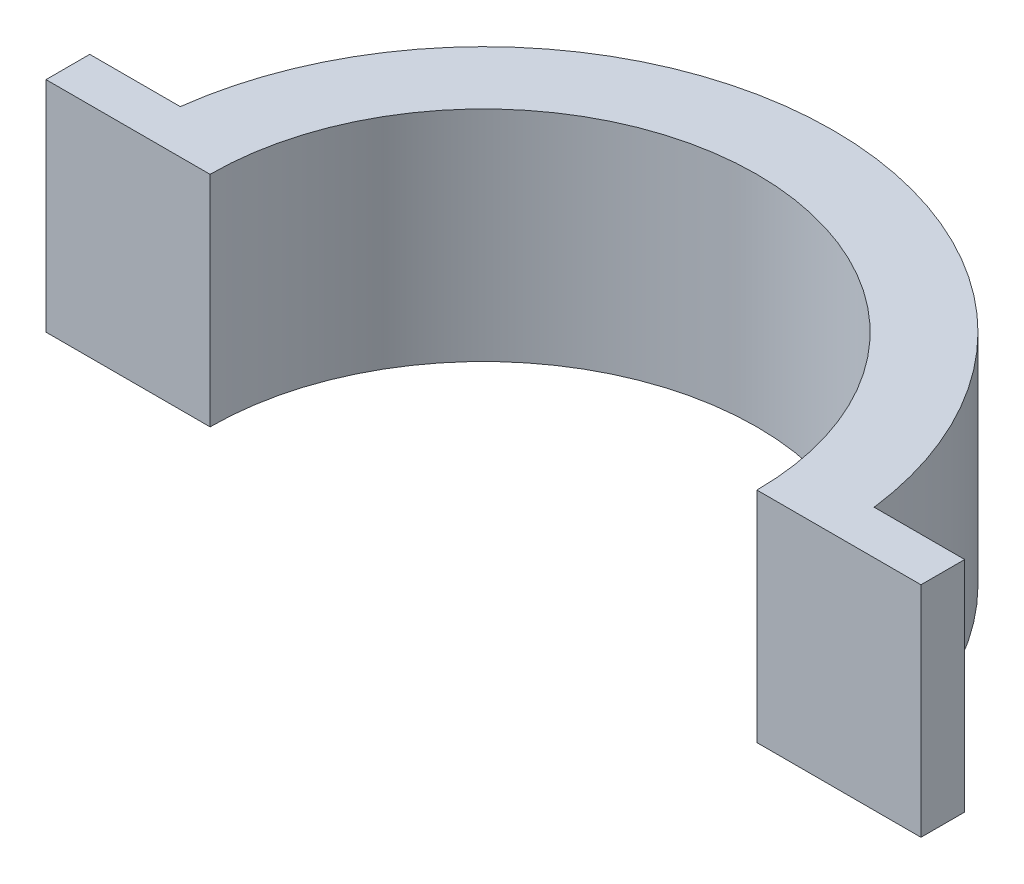
ISO-10303-21;
HEADER;
FILE_DESCRIPTION(('STEP AP214'),'2;1');
FILE_NAME('part.step','',(''),(''),'','','');
FILE_SCHEMA(('AUTOMOTIVE_DESIGN { 1 0 10303 214 1 1 1 1 }'));
ENDSEC;
DATA;
#1=APPLICATION_CONTEXT('core data for automotive mechanical design processes');
#2=APPLICATION_PROTOCOL_DEFINITION('international standard','automotive_design',2000,#1);
#3=PRODUCT_CONTEXT('',#1,'mechanical');
#4=PRODUCT('Part','Part','',(#3));
#5=PRODUCT_RELATED_PRODUCT_CATEGORY('part','',(#4));
#6=PRODUCT_DEFINITION_FORMATION('','',#4);
#7=PRODUCT_DEFINITION_CONTEXT('part definition',#1,'design');
#8=PRODUCT_DEFINITION('design','',#6,#7);
#9=PRODUCT_DEFINITION_SHAPE('','',#8);
#10=(LENGTH_UNIT() NAMED_UNIT(*) SI_UNIT(.MILLI.,.METRE.));
#11=(NAMED_UNIT(*) PLANE_ANGLE_UNIT() SI_UNIT($,.RADIAN.));
#12=(NAMED_UNIT(*) SI_UNIT($,.STERADIAN.) SOLID_ANGLE_UNIT());
#13=UNCERTAINTY_MEASURE_WITH_UNIT(LENGTH_MEASURE(1.E-05),#10,'distance_accuracy_value','');
#14=(GEOMETRIC_REPRESENTATION_CONTEXT(3) GLOBAL_UNCERTAINTY_ASSIGNED_CONTEXT((#13)) GLOBAL_UNIT_ASSIGNED_CONTEXT((#10,
#11,#12)) REPRESENTATION_CONTEXT('',''));
#15=CARTESIAN_POINT('',(0.,0.,0.));
#16=DIRECTION('',(0.,0.,1.));
#17=DIRECTION('',(1.,0.,0.));
#18=AXIS2_PLACEMENT_3D('',#15,#16,#17);
#19=CARTESIAN_POINT('',(0.,10.,0.));
#20=DIRECTION('',(0.,0.,1.));
#21=DIRECTION('',(1.,0.,0.));
#22=AXIS2_PLACEMENT_3D('',#19,#20,#21);
#23=PLANE('',#22);
#24=DIRECTION('',(-1.,0.,0.));
#25=VECTOR('',#24,1.);
#26=CARTESIAN_POINT('',(0.,0.,0.));
#27=LINE('',#26,#25);
#28=CARTESIAN_POINT('',(-12.5,0.,0.));
#29=VERTEX_POINT('',#28);
#30=CARTESIAN_POINT('',(-20.,0.,0.));
#31=VERTEX_POINT('',#30);
#32=EDGE_CURVE('E131',#29,#31,#27,.T.);
#33=ORIENTED_EDGE('',*,*,#32,.F.);
#34=DIRECTION('',(0.,-1.,0.));
#35=VECTOR('',#34,1.);
#36=CARTESIAN_POINT('',(-12.5,10.,0.));
#37=LINE('',#36,#35);
#38=CARTESIAN_POINT('',(-12.5,10.,0.));
#39=VERTEX_POINT('',#38);
#40=EDGE_CURVE('E11',#39,#29,#37,.T.);
#41=ORIENTED_EDGE('',*,*,#40,.F.);
#42=DIRECTION('',(-1.,0.,0.));
#43=VECTOR('',#42,1.);
#44=CARTESIAN_POINT('',(0.,10.,0.));
#45=LINE('',#44,#43);
#46=CARTESIAN_POINT('',(-20.,10.,0.));
#47=VERTEX_POINT('',#46);
#48=EDGE_CURVE('E148',#39,#47,#45,.T.);
#49=ORIENTED_EDGE('',*,*,#48,.T.);
#50=DIRECTION('',(0.,-1.,0.));
#51=VECTOR('',#50,1.);
#52=CARTESIAN_POINT('',(-20.,10.,0.));
#53=LINE('',#52,#51);
#54=EDGE_CURVE('E54',#47,#31,#53,.T.);
#55=ORIENTED_EDGE('',*,*,#54,.T.);
#56=EDGE_LOOP('',(#33,#41,#49,#55));
#57=FACE_BOUND('',#56,.T.);
#58=ADVANCED_FACE('F38',(#57),#23,.T.);
#59=CARTESIAN_POINT('',(0.,10.,0.));
#60=DIRECTION('',(0.,-1.,0.));
#61=DIRECTION('',(0.,0.,-1.));
#62=AXIS2_PLACEMENT_3D('',#59,#60,#61);
#63=CYLINDRICAL_SURFACE('',#62,12.5);
#64=CARTESIAN_POINT('',(0.,0.,0.));
#65=DIRECTION('',(0.,1.,0.));
#66=DIRECTION('',(0.,0.,1.));
#67=AXIS2_PLACEMENT_3D('',#64,#65,#66);
#68=CIRCLE('',#67,12.5);
#69=CARTESIAN_POINT('',(12.5,0.,0.));
#70=VERTEX_POINT('',#69);
#71=EDGE_CURVE('E133',#70,#29,#68,.T.);
#72=ORIENTED_EDGE('',*,*,#71,.F.);
#73=DIRECTION('',(0.,-1.,0.));
#74=VECTOR('',#73,1.);
#75=CARTESIAN_POINT('',(12.5,10.,0.));
#76=LINE('',#75,#74);
#77=CARTESIAN_POINT('',(12.5,10.,0.));
#78=VERTEX_POINT('',#77);
#79=EDGE_CURVE('E46',#78,#70,#76,.T.);
#80=ORIENTED_EDGE('',*,*,#79,.F.);
#81=CARTESIAN_POINT('',(0.,10.,0.));
#82=DIRECTION('',(0.,1.,0.));
#83=DIRECTION('',(0.,0.,1.));
#84=AXIS2_PLACEMENT_3D('',#81,#82,#83);
#85=CIRCLE('',#84,12.5);
#86=EDGE_CURVE('E172',#78,#39,#85,.T.);
#87=ORIENTED_EDGE('',*,*,#86,.T.);
#88=ORIENTED_EDGE('',*,*,#40,.T.);
#89=EDGE_LOOP('',(#72,#80,#87,#88));
#90=FACE_BOUND('',#89,.T.);
#91=ADVANCED_FACE('F171',(#90),#63,.F.);
#92=CARTESIAN_POINT('',(0.,10.,0.));
#93=DIRECTION('',(0.,0.,-1.));
#94=DIRECTION('',(-1.,0.,0.));
#95=AXIS2_PLACEMENT_3D('',#92,#93,#94);
#96=PLANE('',#95);
#97=DIRECTION('',(1.,0.,0.));
#98=VECTOR('',#97,1.);
#99=CARTESIAN_POINT('',(0.,0.,0.));
#100=LINE('',#99,#98);
#101=CARTESIAN_POINT('',(20.,0.,0.));
#102=VERTEX_POINT('',#101);
#103=EDGE_CURVE('E136',#70,#102,#100,.T.);
#104=ORIENTED_EDGE('',*,*,#103,.T.);
#105=DIRECTION('',(0.,-1.,0.));
#106=VECTOR('',#105,1.);
#107=CARTESIAN_POINT('',(20.,10.,0.));
#108=LINE('',#107,#106);
#109=CARTESIAN_POINT('',(20.,10.,0.));
#110=VERTEX_POINT('',#109);
#111=EDGE_CURVE('E155',#110,#102,#108,.T.);
#112=ORIENTED_EDGE('',*,*,#111,.F.);
#113=DIRECTION('',(1.,0.,0.));
#114=VECTOR('',#113,1.);
#115=CARTESIAN_POINT('',(0.,10.,0.));
#116=LINE('',#115,#114);
#117=EDGE_CURVE('E162',#78,#110,#116,.T.);
#118=ORIENTED_EDGE('',*,*,#117,.F.);
#119=ORIENTED_EDGE('',*,*,#79,.T.);
#120=EDGE_LOOP('',(#104,#112,#118,#119));
#121=FACE_BOUND('',#120,.T.);
#122=ADVANCED_FACE('F160',(#121),#96,.F.);
#123=CARTESIAN_POINT('',(20.,10.,0.));
#124=DIRECTION('',(-1.,0.,0.));
#125=DIRECTION('',(0.,0.,1.));
#126=AXIS2_PLACEMENT_3D('',#123,#124,#125);
#127=PLANE('',#126);
#128=DIRECTION('',(0.,0.,-1.));
#129=VECTOR('',#128,1.);
#130=CARTESIAN_POINT('',(20.,0.,0.));
#131=LINE('',#130,#129);
#132=CARTESIAN_POINT('',(20.,0.,-2.));
#133=VERTEX_POINT('',#132);
#134=EDGE_CURVE('E138',#102,#133,#131,.T.);
#135=ORIENTED_EDGE('',*,*,#134,.T.);
#136=DIRECTION('',(0.,-1.,0.));
#137=VECTOR('',#136,1.);
#138=CARTESIAN_POINT('',(20.,10.,-2.));
#139=LINE('',#138,#137);
#140=CARTESIAN_POINT('',(20.,10.,-2.));
#141=VERTEX_POINT('',#140);
#142=EDGE_CURVE('E152',#141,#133,#139,.T.);
#143=ORIENTED_EDGE('',*,*,#142,.F.);
#144=DIRECTION('',(0.,0.,-1.));
#145=VECTOR('',#144,1.);
#146=CARTESIAN_POINT('',(20.,10.,0.));
#147=LINE('',#146,#145);
#148=EDGE_CURVE('E276',#110,#141,#147,.T.);
#149=ORIENTED_EDGE('',*,*,#148,.F.);
#150=ORIENTED_EDGE('',*,*,#111,.T.);
#151=EDGE_LOOP('',(#135,#143,#149,#150));
#152=FACE_BOUND('',#151,.T.);
#153=ADVANCED_FACE('F190',(#152),#127,.F.);
#154=CARTESIAN_POINT('',(0.,10.,-2.));
#155=DIRECTION('',(0.,0.,1.));
#156=DIRECTION('',(1.,0.,0.));
#157=AXIS2_PLACEMENT_3D('',#154,#155,#156);
#158=PLANE('',#157);
#159=DIRECTION('',(-1.,0.,0.));
#160=VECTOR('',#159,1.);
#161=CARTESIAN_POINT('',(0.,0.,-2.));
#162=LINE('',#161,#160);
#163=CARTESIAN_POINT('',(15.8603248711256,0.,-2.));
#164=VERTEX_POINT('',#163);
#165=EDGE_CURVE('E140',#133,#164,#162,.T.);
#166=ORIENTED_EDGE('',*,*,#165,.T.);
#167=DIRECTION('',(0.,-1.,0.));
#168=VECTOR('',#167,1.);
#169=CARTESIAN_POINT('',(15.8603248711256,10.,-2.));
#170=LINE('',#169,#168);
#171=CARTESIAN_POINT('',(15.8603248711256,10.,-2.));
#172=VERTEX_POINT('',#171);
#173=EDGE_CURVE('E123',#172,#164,#170,.T.);
#174=ORIENTED_EDGE('',*,*,#173,.F.);
#175=DIRECTION('',(-1.,0.,0.));
#176=VECTOR('',#175,1.);
#177=CARTESIAN_POINT('',(0.,10.,-2.));
#178=LINE('',#177,#176);
#179=EDGE_CURVE('E111',#141,#172,#178,.T.);
#180=ORIENTED_EDGE('',*,*,#179,.F.);
#181=ORIENTED_EDGE('',*,*,#142,.T.);
#182=EDGE_LOOP('',(#166,#174,#180,#181));
#183=FACE_BOUND('',#182,.T.);
#184=ADVANCED_FACE('F195',(#183),#158,.F.);
#185=CARTESIAN_POINT('',(0.,10.,0.));
#186=DIRECTION('',(0.,-1.,0.));
#187=DIRECTION('',(0.,0.,-1.));
#188=AXIS2_PLACEMENT_3D('',#185,#186,#187);
#189=CYLINDRICAL_SURFACE('',#188,15.9859283439419);
#190=CARTESIAN_POINT('',(0.,0.,0.));
#191=DIRECTION('',(0.,1.,0.));
#192=DIRECTION('',(0.,0.,1.));
#193=AXIS2_PLACEMENT_3D('',#190,#191,#192);
#194=CIRCLE('',#193,15.9859283439419);
#195=CARTESIAN_POINT('',(-15.8603248711256,0.,-2.));
#196=VERTEX_POINT('',#195);
#197=EDGE_CURVE('E120',#164,#196,#194,.T.);
#198=ORIENTED_EDGE('',*,*,#197,.T.);
#199=DIRECTION('',(0.,-1.,0.));
#200=VECTOR('',#199,1.);
#201=CARTESIAN_POINT('',(-15.8603248711256,10.,-2.));
#202=LINE('',#201,#200);
#203=CARTESIAN_POINT('',(-15.8603248711256,10.,-2.));
#204=VERTEX_POINT('',#203);
#205=EDGE_CURVE('E117',#204,#196,#202,.T.);
#206=ORIENTED_EDGE('',*,*,#205,.F.);
#207=CARTESIAN_POINT('',(0.,10.,0.));
#208=DIRECTION('',(0.,1.,0.));
#209=DIRECTION('',(0.,0.,1.));
#210=AXIS2_PLACEMENT_3D('',#207,#208,#209);
#211=CIRCLE('',#210,15.9859283439419);
#212=EDGE_CURVE('E104',#172,#204,#211,.T.);
#213=ORIENTED_EDGE('',*,*,#212,.F.);
#214=ORIENTED_EDGE('',*,*,#173,.T.);
#215=EDGE_LOOP('',(#198,#206,#213,#214));
#216=FACE_BOUND('',#215,.T.);
#217=ADVANCED_FACE('F118',(#216),#189,.T.);
#218=CARTESIAN_POINT('',(0.,10.,-2.));
#219=DIRECTION('',(0.,0.,-1.));
#220=DIRECTION('',(-1.,0.,0.));
#221=AXIS2_PLACEMENT_3D('',#218,#219,#220);
#222=PLANE('',#221);
#223=DIRECTION('',(1.,0.,0.));
#224=VECTOR('',#223,1.);
#225=CARTESIAN_POINT('',(0.,0.,-2.));
#226=LINE('',#225,#224);
#227=CARTESIAN_POINT('',(-20.,0.,-2.));
#228=VERTEX_POINT('',#227);
#229=EDGE_CURVE('E143',#228,#196,#226,.T.);
#230=ORIENTED_EDGE('',*,*,#229,.F.);
#231=DIRECTION('',(0.,-1.,0.));
#232=VECTOR('',#231,1.);
#233=CARTESIAN_POINT('',(-20.,10.,-2.));
#234=LINE('',#233,#232);
#235=CARTESIAN_POINT('',(-20.,10.,-2.));
#236=VERTEX_POINT('',#235);
#237=EDGE_CURVE('E79',#236,#228,#234,.T.);
#238=ORIENTED_EDGE('',*,*,#237,.F.);
#239=DIRECTION('',(1.,0.,0.));
#240=VECTOR('',#239,1.);
#241=CARTESIAN_POINT('',(0.,10.,-2.));
#242=LINE('',#241,#240);
#243=EDGE_CURVE('E109',#236,#204,#242,.T.);
#244=ORIENTED_EDGE('',*,*,#243,.T.);
#245=ORIENTED_EDGE('',*,*,#205,.T.);
#246=EDGE_LOOP('',(#230,#238,#244,#245));
#247=FACE_BOUND('',#246,.T.);
#248=ADVANCED_FACE('F125',(#247),#222,.T.);
#249=CARTESIAN_POINT('',(-20.,10.,0.));
#250=DIRECTION('',(-1.,0.,0.));
#251=DIRECTION('',(0.,0.,1.));
#252=AXIS2_PLACEMENT_3D('',#249,#250,#251);
#253=PLANE('',#252);
#254=DIRECTION('',(0.,0.,-1.));
#255=VECTOR('',#254,1.);
#256=CARTESIAN_POINT('',(-20.,0.,0.));
#257=LINE('',#256,#255);
#258=EDGE_CURVE('E145',#31,#228,#257,.T.);
#259=ORIENTED_EDGE('',*,*,#258,.F.);
#260=ORIENTED_EDGE('',*,*,#54,.F.);
#261=DIRECTION('',(0.,0.,-1.));
#262=VECTOR('',#261,1.);
#263=CARTESIAN_POINT('',(-20.,10.,0.));
#264=LINE('',#263,#262);
#265=EDGE_CURVE('E126',#47,#236,#264,.T.);
#266=ORIENTED_EDGE('',*,*,#265,.T.);
#267=ORIENTED_EDGE('',*,*,#237,.T.);
#268=EDGE_LOOP('',(#259,#260,#266,#267));
#269=FACE_BOUND('',#268,.T.);
#270=ADVANCED_FACE('F173',(#269),#253,.T.);
#271=CARTESIAN_POINT('',(0.,10.,0.));
#272=DIRECTION('',(0.,1.,0.));
#273=DIRECTION('',(0.,0.,1.));
#274=AXIS2_PLACEMENT_3D('',#271,#272,#273);
#275=PLANE('',#274);
#276=ORIENTED_EDGE('',*,*,#48,.F.);
#277=ORIENTED_EDGE('',*,*,#86,.F.);
#278=ORIENTED_EDGE('',*,*,#117,.T.);
#279=ORIENTED_EDGE('',*,*,#148,.T.);
#280=ORIENTED_EDGE('',*,*,#179,.T.);
#281=ORIENTED_EDGE('',*,*,#212,.T.);
#282=ORIENTED_EDGE('',*,*,#243,.F.);
#283=ORIENTED_EDGE('',*,*,#265,.F.);
#284=EDGE_LOOP('',(#276,#277,#278,#279,#280,#281,#282,#283));
#285=FACE_BOUND('',#284,.T.);
#286=ADVANCED_FACE('F106',(#285),#275,.T.);
#287=CARTESIAN_POINT('',(0.,0.,0.));
#288=DIRECTION('',(0.,1.,0.));
#289=DIRECTION('',(0.,0.,1.));
#290=AXIS2_PLACEMENT_3D('',#287,#288,#289);
#291=PLANE('',#290);
#292=ORIENTED_EDGE('',*,*,#32,.T.);
#293=ORIENTED_EDGE('',*,*,#258,.T.);
#294=ORIENTED_EDGE('',*,*,#229,.T.);
#295=ORIENTED_EDGE('',*,*,#197,.F.);
#296=ORIENTED_EDGE('',*,*,#165,.F.);
#297=ORIENTED_EDGE('',*,*,#134,.F.);
#298=ORIENTED_EDGE('',*,*,#103,.F.);
#299=ORIENTED_EDGE('',*,*,#71,.T.);
#300=EDGE_LOOP('',(#292,#293,#294,#295,#296,#297,#298,#299));
#301=FACE_BOUND('',#300,.T.);
#302=ADVANCED_FACE('F169',(#301),#291,.F.);
#303=CLOSED_SHELL('',(#58,#91,#122,#153,#184,#217,#248,#270,#286,#302));
#304=MANIFOLD_SOLID_BREP('B2',#303);
#305=ADVANCED_BREP_SHAPE_REPRESENTATION('',(#18,#304),#14);
#306=SHAPE_DEFINITION_REPRESENTATION(#9,#305);
ENDSEC;
END-ISO-10303-21;
